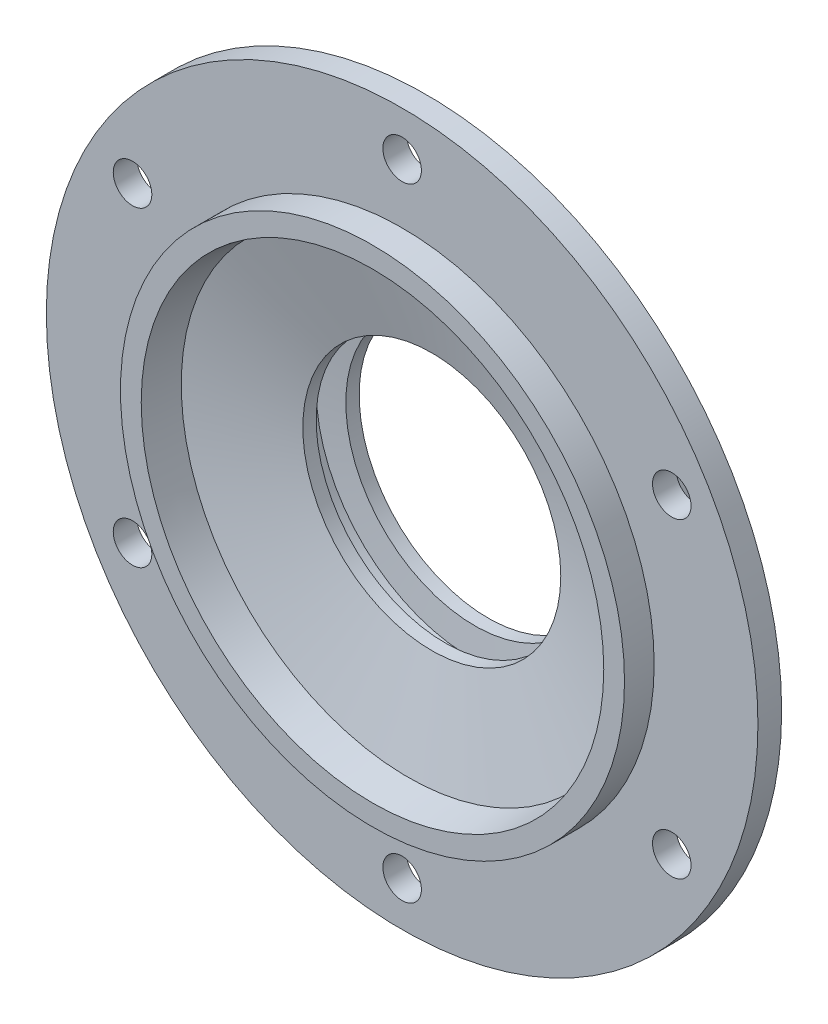
ISO-10303-21;
HEADER;
FILE_DESCRIPTION(('STEP AP214'),'2;1');
FILE_NAME('part.step','',(''),(''),'','','');
FILE_SCHEMA(('AUTOMOTIVE_DESIGN { 1 0 10303 214 1 1 1 1 }'));
ENDSEC;
DATA;
#1=APPLICATION_CONTEXT('core data for automotive mechanical design processes');
#2=APPLICATION_PROTOCOL_DEFINITION('international standard','automotive_design',2000,#1);
#3=PRODUCT_CONTEXT('',#1,'mechanical');
#4=PRODUCT('Part','Part','',(#3));
#5=PRODUCT_RELATED_PRODUCT_CATEGORY('part','',(#4));
#6=PRODUCT_DEFINITION_FORMATION('','',#4);
#7=PRODUCT_DEFINITION_CONTEXT('part definition',#1,'design');
#8=PRODUCT_DEFINITION('design','',#6,#7);
#9=PRODUCT_DEFINITION_SHAPE('','',#8);
#10=(LENGTH_UNIT() NAMED_UNIT(*) SI_UNIT(.MILLI.,.METRE.));
#11=(NAMED_UNIT(*) PLANE_ANGLE_UNIT() SI_UNIT($,.RADIAN.));
#12=(NAMED_UNIT(*) SI_UNIT($,.STERADIAN.) SOLID_ANGLE_UNIT());
#13=UNCERTAINTY_MEASURE_WITH_UNIT(LENGTH_MEASURE(1.E-05),#10,'distance_accuracy_value','');
#14=(GEOMETRIC_REPRESENTATION_CONTEXT(3) GLOBAL_UNCERTAINTY_ASSIGNED_CONTEXT((#13)) GLOBAL_UNIT_ASSIGNED_CONTEXT((#10,
#11,#12)) REPRESENTATION_CONTEXT('',''));
#15=CARTESIAN_POINT('',(0.,0.,0.));
#16=DIRECTION('',(0.,0.,1.));
#17=DIRECTION('',(1.,0.,0.));
#18=AXIS2_PLACEMENT_3D('',#15,#16,#17);
#19=CARTESIAN_POINT('',(0.,0.,17.5000000000001));
#20=DIRECTION('',(0.,0.,1.));
#21=DIRECTION('',(1.,0.,0.));
#22=AXIS2_PLACEMENT_3D('',#19,#20,#21);
#23=CONICAL_SURFACE('',#22,76.5,1.33296039933744);
#24=CARTESIAN_POINT('',(0.,0.,9.49999999999995));
#25=DIRECTION('',(0.,0.,1.));
#26=DIRECTION('',(1.,0.,0.));
#27=AXIS2_PLACEMENT_3D('',#24,#25,#26);
#28=CIRCLE('',#27,43.5);
#29=CARTESIAN_POINT('',(43.5,0.,9.49999999999995));
#30=VERTEX_POINT('',#29);
#31=EDGE_CURVE('E10',#30,#30,#28,.T.);
#32=ORIENTED_EDGE('',*,*,#31,.F.);
#33=EDGE_LOOP('',(#32));
#34=FACE_BOUND('',#33,.T.);
#35=CARTESIAN_POINT('',(0.,0.,17.5000000000001));
#36=DIRECTION('',(0.,0.,1.));
#37=DIRECTION('',(1.,0.,0.));
#38=AXIS2_PLACEMENT_3D('',#35,#36,#37);
#39=CIRCLE('',#38,76.5);
#40=CARTESIAN_POINT('',(76.5,0.,17.5000000000001));
#41=VERTEX_POINT('',#40);
#42=EDGE_CURVE('E51',#41,#41,#39,.T.);
#43=ORIENTED_EDGE('',*,*,#42,.T.);
#44=EDGE_LOOP('',(#43));
#45=FACE_BOUND('',#44,.T.);
#46=ADVANCED_FACE('F32',(#34,#45),#23,.F.);
#47=CARTESIAN_POINT('',(0.,0.,1000.));
#48=DIRECTION('',(0.,0.,1.));
#49=DIRECTION('',(1.,0.,0.));
#50=AXIS2_PLACEMENT_3D('',#47,#48,#49);
#51=CYLINDRICAL_SURFACE('',#50,43.4999999999999);
#52=CARTESIAN_POINT('',(0.,0.,5.));
#53=DIRECTION('',(0.,0.,1.));
#54=DIRECTION('',(1.,0.,0.));
#55=AXIS2_PLACEMENT_3D('',#52,#53,#54);
#56=CIRCLE('',#55,43.4999999999999);
#57=CARTESIAN_POINT('',(43.4999999999999,0.,5.));
#58=VERTEX_POINT('',#57);
#59=EDGE_CURVE('E39',#58,#58,#56,.T.);
#60=ORIENTED_EDGE('',*,*,#59,.F.);
#61=EDGE_LOOP('',(#60));
#62=FACE_BOUND('',#61,.T.);
#63=ORIENTED_EDGE('',*,*,#31,.T.);
#64=EDGE_LOOP('',(#63));
#65=FACE_BOUND('',#64,.T.);
#66=ADVANCED_FACE('F130',(#62,#65),#51,.F.);
#67=CARTESIAN_POINT('',(0.,0.,5.));
#68=DIRECTION('',(0.,0.,-1.));
#69=DIRECTION('',(-1.,0.,0.));
#70=AXIS2_PLACEMENT_3D('',#67,#68,#69);
#71=CONICAL_SURFACE('',#70,43.4999999999999,1.460139105621);
#72=CARTESIAN_POINT('',(0.,0.,4.));
#73=DIRECTION('',(0.,0.,1.));
#74=DIRECTION('',(1.,0.,0.));
#75=AXIS2_PLACEMENT_3D('',#72,#73,#74);
#76=CIRCLE('',#75,52.5);
#77=CARTESIAN_POINT('',(52.5,0.,4.));
#78=VERTEX_POINT('',#77);
#79=EDGE_CURVE('E44',#78,#78,#76,.T.);
#80=ORIENTED_EDGE('',*,*,#79,.F.);
#81=EDGE_LOOP('',(#80));
#82=FACE_BOUND('',#81,.T.);
#83=ORIENTED_EDGE('',*,*,#59,.T.);
#84=EDGE_LOOP('',(#83));
#85=FACE_BOUND('',#84,.T.);
#86=ADVANCED_FACE('F127',(#82,#85),#71,.F.);
#87=CARTESIAN_POINT('',(0.,0.,1000.));
#88=DIRECTION('',(0.,0.,1.));
#89=DIRECTION('',(1.,0.,0.));
#90=AXIS2_PLACEMENT_3D('',#87,#88,#89);
#91=CYLINDRICAL_SURFACE('',#90,52.5);
#92=CARTESIAN_POINT('',(0.,0.,-4.));
#93=DIRECTION('',(0.,0.,1.));
#94=DIRECTION('',(1.,0.,0.));
#95=AXIS2_PLACEMENT_3D('',#92,#93,#94);
#96=CIRCLE('',#95,52.5);
#97=CARTESIAN_POINT('',(52.5,0.,-4.));
#98=VERTEX_POINT('',#97);
#99=EDGE_CURVE('E120',#98,#98,#96,.T.);
#100=ORIENTED_EDGE('',*,*,#99,.F.);
#101=EDGE_LOOP('',(#100));
#102=FACE_BOUND('',#101,.T.);
#103=ORIENTED_EDGE('',*,*,#79,.T.);
#104=EDGE_LOOP('',(#103));
#105=FACE_BOUND('',#104,.T.);
#106=ADVANCED_FACE('F125',(#102,#105),#91,.F.);
#107=CARTESIAN_POINT('',(0.,0.,-4.));
#108=DIRECTION('',(0.,0.,1.));
#109=DIRECTION('',(1.,0.,0.));
#110=AXIS2_PLACEMENT_3D('',#107,#108,#109);
#111=CONICAL_SURFACE('',#110,52.5,1.46013910562101);
#112=CARTESIAN_POINT('',(0.,0.,-4.99999999999989));
#113=DIRECTION('',(0.,0.,1.));
#114=DIRECTION('',(1.,0.,0.));
#115=AXIS2_PLACEMENT_3D('',#112,#113,#114);
#116=CIRCLE('',#115,43.4999999999999);
#117=CARTESIAN_POINT('',(43.4999999999999,0.,-4.99999999999989));
#118=VERTEX_POINT('',#117);
#119=EDGE_CURVE('E117',#118,#118,#116,.T.);
#120=ORIENTED_EDGE('',*,*,#119,.F.);
#121=EDGE_LOOP('',(#120));
#122=FACE_BOUND('',#121,.T.);
#123=ORIENTED_EDGE('',*,*,#99,.T.);
#124=EDGE_LOOP('',(#123));
#125=FACE_BOUND('',#124,.T.);
#126=ADVANCED_FACE('F142',(#122,#125),#111,.F.);
#127=CARTESIAN_POINT('',(0.,0.,1000.));
#128=DIRECTION('',(0.,0.,1.));
#129=DIRECTION('',(1.,0.,0.));
#130=AXIS2_PLACEMENT_3D('',#127,#128,#129);
#131=CYLINDRICAL_SURFACE('',#130,43.4999999999999);
#132=CARTESIAN_POINT('',(0.,0.,-9.50000000000006));
#133=DIRECTION('',(0.,0.,1.));
#134=DIRECTION('',(1.,0.,0.));
#135=AXIS2_PLACEMENT_3D('',#132,#133,#134);
#136=CIRCLE('',#135,43.5);
#137=CARTESIAN_POINT('',(43.5,0.,-9.50000000000006));
#138=VERTEX_POINT('',#137);
#139=EDGE_CURVE('E114',#138,#138,#136,.T.);
#140=ORIENTED_EDGE('',*,*,#139,.F.);
#141=EDGE_LOOP('',(#140));
#142=FACE_BOUND('',#141,.T.);
#143=ORIENTED_EDGE('',*,*,#119,.T.);
#144=EDGE_LOOP('',(#143));
#145=FACE_BOUND('',#144,.T.);
#146=ADVANCED_FACE('F146',(#142,#145),#131,.F.);
#147=CARTESIAN_POINT('',(0.,43.5,-9.50000000000003));
#148=DIRECTION('',(0.,0.,1.));
#149=DIRECTION('',(1.,0.,0.));
#150=AXIS2_PLACEMENT_3D('',#147,#148,#149);
#151=PLANE('',#150);
#152=CARTESIAN_POINT('',(0.,0.,-9.50000000000006));
#153=DIRECTION('',(0.,0.,1.));
#154=DIRECTION('',(1.,0.,0.));
#155=AXIS2_PLACEMENT_3D('',#152,#153,#154);
#156=CIRCLE('',#155,63.);
#157=CARTESIAN_POINT('',(63.,0.,-9.50000000000006));
#158=VERTEX_POINT('',#157);
#159=EDGE_CURVE('E111',#158,#158,#156,.T.);
#160=ORIENTED_EDGE('',*,*,#159,.F.);
#161=EDGE_LOOP('',(#160));
#162=FACE_BOUND('',#161,.T.);
#163=ORIENTED_EDGE('',*,*,#139,.T.);
#164=EDGE_LOOP('',(#163));
#165=FACE_BOUND('',#164,.T.);
#166=ADVANCED_FACE('F150',(#162,#165),#151,.F.);
#167=CARTESIAN_POINT('',(0.,0.,1000.));
#168=DIRECTION('',(0.,0.,1.));
#169=DIRECTION('',(1.,0.,0.));
#170=AXIS2_PLACEMENT_3D('',#167,#168,#169);
#171=CYLINDRICAL_SURFACE('',#170,63.);
#172=CARTESIAN_POINT('',(0.,0.,-2.49999999999995));
#173=DIRECTION('',(0.,0.,1.));
#174=DIRECTION('',(1.,0.,0.));
#175=AXIS2_PLACEMENT_3D('',#172,#173,#174);
#176=CIRCLE('',#175,63.);
#177=CARTESIAN_POINT('',(63.,0.,-2.49999999999995));
#178=VERTEX_POINT('',#177);
#179=EDGE_CURVE('E108',#178,#178,#176,.T.);
#180=ORIENTED_EDGE('',*,*,#179,.F.);
#181=EDGE_LOOP('',(#180));
#182=FACE_BOUND('',#181,.T.);
#183=ORIENTED_EDGE('',*,*,#159,.T.);
#184=EDGE_LOOP('',(#183));
#185=FACE_BOUND('',#184,.T.);
#186=ADVANCED_FACE('F154',(#182,#185),#171,.T.);
#187=CARTESIAN_POINT('',(0.,63.,-2.5));
#188=DIRECTION('',(0.,0.,1.));
#189=DIRECTION('',(1.,0.,0.));
#190=AXIS2_PLACEMENT_3D('',#187,#188,#189);
#191=PLANE('',#190);
#192=CARTESIAN_POINT('',(0.,0.,-2.49999999999995));
#193=DIRECTION('',(0.,0.,1.));
#194=DIRECTION('',(1.,0.,0.));
#195=AXIS2_PLACEMENT_3D('',#192,#193,#194);
#196=CIRCLE('',#195,85.);
#197=CARTESIAN_POINT('',(85.,0.,-2.49999999999995));
#198=VERTEX_POINT('',#197);
#199=EDGE_CURVE('E105',#198,#198,#196,.T.);
#200=ORIENTED_EDGE('',*,*,#199,.F.);
#201=EDGE_LOOP('',(#200));
#202=FACE_BOUND('',#201,.T.);
#203=ORIENTED_EDGE('',*,*,#179,.T.);
#204=EDGE_LOOP('',(#203));
#205=FACE_BOUND('',#204,.T.);
#206=ADVANCED_FACE('F158',(#202,#205),#191,.F.);
#207=CARTESIAN_POINT('',(0.,0.,1000.));
#208=DIRECTION('',(0.,0.,1.));
#209=DIRECTION('',(1.,0.,0.));
#210=AXIS2_PLACEMENT_3D('',#207,#208,#209);
#211=CYLINDRICAL_SURFACE('',#210,85.);
#212=CARTESIAN_POINT('',(0.,0.,11.5));
#213=DIRECTION('',(0.,0.,1.));
#214=DIRECTION('',(1.,0.,0.));
#215=AXIS2_PLACEMENT_3D('',#212,#213,#214);
#216=CIRCLE('',#215,85.);
#217=CARTESIAN_POINT('',(85.,0.,11.5));
#218=VERTEX_POINT('',#217);
#219=EDGE_CURVE('E102',#218,#218,#216,.T.);
#220=ORIENTED_EDGE('',*,*,#219,.F.);
#221=EDGE_LOOP('',(#220));
#222=FACE_BOUND('',#221,.T.);
#223=ORIENTED_EDGE('',*,*,#199,.T.);
#224=EDGE_LOOP('',(#223));
#225=FACE_BOUND('',#224,.T.);
#226=ADVANCED_FACE('F162',(#222,#225),#211,.T.);
#227=CARTESIAN_POINT('',(0.,85.,11.5));
#228=DIRECTION('',(0.,0.,1.));
#229=DIRECTION('',(1.,0.,0.));
#230=AXIS2_PLACEMENT_3D('',#227,#228,#229);
#231=PLANE('',#230);
#232=CARTESIAN_POINT('',(90.9326673973654,52.5000000000011,11.5));
#233=DIRECTION('',(0.,0.,-1.));
#234=DIRECTION('',(-0.50000000000001,0.866025403784433,0.));
#235=AXIS2_PLACEMENT_3D('',#232,#233,#234);
#236=CIRCLE('',#235,6.5);
#237=CARTESIAN_POINT('',(87.6826673973654,58.1291651245999,11.5));
#238=VERTEX_POINT('',#237);
#239=EDGE_CURVE('E76',#238,#238,#236,.T.);
#240=ORIENTED_EDGE('',*,*,#239,.F.);
#241=EDGE_LOOP('',(#240));
#242=FACE_BOUND('',#241,.T.);
#243=CARTESIAN_POINT('',(90.9326673973665,-52.4999999999992,11.5));
#244=DIRECTION('',(0.,0.,-1.));
#245=DIRECTION('',(0.499999999999992,0.866025403784443,0.));
#246=AXIS2_PLACEMENT_3D('',#243,#244,#245);
#247=CIRCLE('',#246,6.5);
#248=CARTESIAN_POINT('',(94.1826673973665,-46.8708348754003,11.5));
#249=VERTEX_POINT('',#248);
#250=EDGE_CURVE('E66',#249,#249,#247,.T.);
#251=ORIENTED_EDGE('',*,*,#250,.F.);
#252=EDGE_LOOP('',(#251));
#253=FACE_BOUND('',#252,.T.);
#254=CARTESIAN_POINT('',(0.,-105.,11.5));
#255=DIRECTION('',(0.,0.,-1.));
#256=DIRECTION('',(1.,0.,0.));
#257=AXIS2_PLACEMENT_3D('',#254,#255,#256);
#258=CIRCLE('',#257,6.5);
#259=CARTESIAN_POINT('',(6.5,-105.,11.5));
#260=VERTEX_POINT('',#259);
#261=EDGE_CURVE('E63',#260,#260,#258,.T.);
#262=ORIENTED_EDGE('',*,*,#261,.F.);
#263=EDGE_LOOP('',(#262));
#264=FACE_BOUND('',#263,.T.);
#265=CARTESIAN_POINT('',(-90.9326673973658,-52.5000000000004,11.5));
#266=DIRECTION('',(0.,0.,-1.));
#267=DIRECTION('',(0.500000000000004,-0.866025403784436,0.));
#268=AXIS2_PLACEMENT_3D('',#265,#266,#267);
#269=CIRCLE('',#268,6.5);
#270=CARTESIAN_POINT('',(-87.6826673973658,-58.1291651245993,11.5));
#271=VERTEX_POINT('',#270);
#272=EDGE_CURVE('E60',#271,#271,#269,.T.);
#273=ORIENTED_EDGE('',*,*,#272,.F.);
#274=EDGE_LOOP('',(#273));
#275=FACE_BOUND('',#274,.T.);
#276=CARTESIAN_POINT('',(-90.9326673973662,52.4999999999998,11.5));
#277=DIRECTION('',(0.,0.,-1.));
#278=DIRECTION('',(-0.499999999999998,-0.86602540378444,0.));
#279=AXIS2_PLACEMENT_3D('',#276,#277,#278);
#280=CIRCLE('',#279,6.5);
#281=CARTESIAN_POINT('',(-94.1826673973662,46.8708348754009,11.5));
#282=VERTEX_POINT('',#281);
#283=EDGE_CURVE('E56',#282,#282,#280,.T.);
#284=ORIENTED_EDGE('',*,*,#283,.F.);
#285=EDGE_LOOP('',(#284));
#286=FACE_BOUND('',#285,.T.);
#287=CARTESIAN_POINT('',(0.,105.,11.5));
#288=DIRECTION('',(0.,0.,-1.));
#289=DIRECTION('',(-1.,0.,0.));
#290=AXIS2_PLACEMENT_3D('',#287,#288,#289);
#291=CIRCLE('',#290,6.5);
#292=CARTESIAN_POINT('',(-6.5,105.,11.5));
#293=VERTEX_POINT('',#292);
#294=EDGE_CURVE('E52',#293,#293,#291,.T.);
#295=ORIENTED_EDGE('',*,*,#294,.F.);
#296=EDGE_LOOP('',(#295));
#297=FACE_BOUND('',#296,.T.);
#298=CARTESIAN_POINT('',(0.,0.,11.5000000000001));
#299=DIRECTION('',(0.,0.,1.));
#300=DIRECTION('',(1.,0.,0.));
#301=AXIS2_PLACEMENT_3D('',#298,#299,#300);
#302=CIRCLE('',#301,120.);
#303=CARTESIAN_POINT('',(120.,0.,11.5000000000001));
#304=VERTEX_POINT('',#303);
#305=EDGE_CURVE('E99',#304,#304,#302,.T.);
#306=ORIENTED_EDGE('',*,*,#305,.F.);
#307=EDGE_LOOP('',(#306));
#308=FACE_BOUND('',#307,.T.);
#309=ORIENTED_EDGE('',*,*,#219,.T.);
#310=EDGE_LOOP('',(#309));
#311=FACE_BOUND('',#310,.T.);
#312=ADVANCED_FACE('F166',(#242,#253,#264,#275,#286,#297,#308,#311),#231,.F.);
#313=CARTESIAN_POINT('',(0.,0.,1000.));
#314=DIRECTION('',(0.,0.,1.));
#315=DIRECTION('',(1.,0.,0.));
#316=AXIS2_PLACEMENT_3D('',#313,#314,#315);
#317=CYLINDRICAL_SURFACE('',#316,120.);
#318=CARTESIAN_POINT('',(0.,0.,19.5000000000001));
#319=DIRECTION('',(0.,0.,1.));
#320=DIRECTION('',(1.,0.,0.));
#321=AXIS2_PLACEMENT_3D('',#318,#319,#320);
#322=CIRCLE('',#321,120.);
#323=CARTESIAN_POINT('',(120.,0.,19.5000000000001));
#324=VERTEX_POINT('',#323);
#325=EDGE_CURVE('E96',#324,#324,#322,.T.);
#326=ORIENTED_EDGE('',*,*,#325,.F.);
#327=EDGE_LOOP('',(#326));
#328=FACE_BOUND('',#327,.T.);
#329=ORIENTED_EDGE('',*,*,#305,.T.);
#330=EDGE_LOOP('',(#329));
#331=FACE_BOUND('',#330,.T.);
#332=ADVANCED_FACE('F170',(#328,#331),#317,.T.);
#333=CARTESIAN_POINT('',(0.,120.,19.5));
#334=DIRECTION('',(0.,0.,-1.));
#335=DIRECTION('',(-1.,0.,0.));
#336=AXIS2_PLACEMENT_3D('',#333,#334,#335);
#337=PLANE('',#336);
#338=CARTESIAN_POINT('',(90.9326673973654,52.5000000000011,19.5));
#339=DIRECTION('',(0.,0.,-1.));
#340=DIRECTION('',(-1.,0.,0.));
#341=AXIS2_PLACEMENT_3D('',#338,#339,#340);
#342=CIRCLE('',#341,6.5);
#343=CARTESIAN_POINT('',(84.4326673973654,52.5000000000011,19.5));
#344=VERTEX_POINT('',#343);
#345=EDGE_CURVE('E35',#344,#344,#342,.T.);
#346=ORIENTED_EDGE('',*,*,#345,.T.);
#347=EDGE_LOOP('',(#346));
#348=FACE_BOUND('',#347,.T.);
#349=CARTESIAN_POINT('',(90.9326673973665,-52.4999999999992,19.5));
#350=DIRECTION('',(0.,0.,-1.));
#351=DIRECTION('',(-1.,0.,0.));
#352=AXIS2_PLACEMENT_3D('',#349,#350,#351);
#353=CIRCLE('',#352,6.5);
#354=CARTESIAN_POINT('',(84.4326673973665,-52.4999999999992,19.5));
#355=VERTEX_POINT('',#354);
#356=EDGE_CURVE('E64',#355,#355,#353,.T.);
#357=ORIENTED_EDGE('',*,*,#356,.T.);
#358=EDGE_LOOP('',(#357));
#359=FACE_BOUND('',#358,.T.);
#360=CARTESIAN_POINT('',(0.,-105.,19.5));
#361=DIRECTION('',(0.,0.,-1.));
#362=DIRECTION('',(-1.,0.,0.));
#363=AXIS2_PLACEMENT_3D('',#360,#361,#362);
#364=CIRCLE('',#363,6.5);
#365=CARTESIAN_POINT('',(-6.5,-105.,19.5));
#366=VERTEX_POINT('',#365);
#367=EDGE_CURVE('E61',#366,#366,#364,.T.);
#368=ORIENTED_EDGE('',*,*,#367,.T.);
#369=EDGE_LOOP('',(#368));
#370=FACE_BOUND('',#369,.T.);
#371=CARTESIAN_POINT('',(-90.9326673973658,-52.5000000000004,19.5));
#372=DIRECTION('',(0.,0.,-1.));
#373=DIRECTION('',(-1.,0.,0.));
#374=AXIS2_PLACEMENT_3D('',#371,#372,#373);
#375=CIRCLE('',#374,6.5);
#376=CARTESIAN_POINT('',(-97.4326673973658,-52.5000000000004,19.5));
#377=VERTEX_POINT('',#376);
#378=EDGE_CURVE('E57',#377,#377,#375,.T.);
#379=ORIENTED_EDGE('',*,*,#378,.T.);
#380=EDGE_LOOP('',(#379));
#381=FACE_BOUND('',#380,.T.);
#382=CARTESIAN_POINT('',(-90.9326673973662,52.4999999999998,19.5));
#383=DIRECTION('',(0.,0.,-1.));
#384=DIRECTION('',(-1.,0.,0.));
#385=AXIS2_PLACEMENT_3D('',#382,#383,#384);
#386=CIRCLE('',#385,6.5);
#387=CARTESIAN_POINT('',(-97.4326673973662,52.4999999999998,19.5));
#388=VERTEX_POINT('',#387);
#389=EDGE_CURVE('E53',#388,#388,#386,.T.);
#390=ORIENTED_EDGE('',*,*,#389,.T.);
#391=EDGE_LOOP('',(#390));
#392=FACE_BOUND('',#391,.T.);
#393=CARTESIAN_POINT('',(0.,105.,19.5));
#394=DIRECTION('',(0.,0.,-1.));
#395=DIRECTION('',(-1.,0.,0.));
#396=AXIS2_PLACEMENT_3D('',#393,#394,#395);
#397=CIRCLE('',#396,6.5);
#398=CARTESIAN_POINT('',(-6.5,105.,19.5));
#399=VERTEX_POINT('',#398);
#400=EDGE_CURVE('E48',#399,#399,#397,.T.);
#401=ORIENTED_EDGE('',*,*,#400,.T.);
#402=EDGE_LOOP('',(#401));
#403=FACE_BOUND('',#402,.T.);
#404=CARTESIAN_POINT('',(0.,0.,19.5000000000001));
#405=DIRECTION('',(0.,0.,1.));
#406=DIRECTION('',(1.,0.,0.));
#407=AXIS2_PLACEMENT_3D('',#404,#405,#406);
#408=CIRCLE('',#407,85.);
#409=CARTESIAN_POINT('',(85.,0.,19.5000000000001));
#410=VERTEX_POINT('',#409);
#411=EDGE_CURVE('E93',#410,#410,#408,.T.);
#412=ORIENTED_EDGE('',*,*,#411,.F.);
#413=EDGE_LOOP('',(#412));
#414=FACE_BOUND('',#413,.T.);
#415=ORIENTED_EDGE('',*,*,#325,.T.);
#416=EDGE_LOOP('',(#415));
#417=FACE_BOUND('',#416,.T.);
#418=ADVANCED_FACE('F174',(#348,#359,#370,#381,#392,#403,#414,#417),#337,.F.);
#419=CARTESIAN_POINT('',(0.,0.,1000.));
#420=DIRECTION('',(0.,0.,1.));
#421=DIRECTION('',(1.,0.,0.));
#422=AXIS2_PLACEMENT_3D('',#419,#420,#421);
#423=CYLINDRICAL_SURFACE('',#422,85.);
#424=CARTESIAN_POINT('',(0.,0.,29.5));
#425=DIRECTION('',(0.,0.,1.));
#426=DIRECTION('',(1.,0.,0.));
#427=AXIS2_PLACEMENT_3D('',#424,#425,#426);
#428=CIRCLE('',#427,85.);
#429=CARTESIAN_POINT('',(85.,0.,29.5));
#430=VERTEX_POINT('',#429);
#431=EDGE_CURVE('E90',#430,#430,#428,.T.);
#432=ORIENTED_EDGE('',*,*,#431,.F.);
#433=EDGE_LOOP('',(#432));
#434=FACE_BOUND('',#433,.T.);
#435=ORIENTED_EDGE('',*,*,#411,.T.);
#436=EDGE_LOOP('',(#435));
#437=FACE_BOUND('',#436,.T.);
#438=ADVANCED_FACE('F178',(#434,#437),#423,.T.);
#439=CARTESIAN_POINT('',(0.,85.,29.5));
#440=DIRECTION('',(0.,0.,-1.));
#441=DIRECTION('',(-1.,0.,0.));
#442=AXIS2_PLACEMENT_3D('',#439,#440,#441);
#443=PLANE('',#442);
#444=CARTESIAN_POINT('',(0.,0.,29.5));
#445=DIRECTION('',(0.,0.,1.));
#446=DIRECTION('',(1.,0.,0.));
#447=AXIS2_PLACEMENT_3D('',#444,#445,#446);
#448=CIRCLE('',#447,78.);
#449=CARTESIAN_POINT('',(78.,0.,29.5));
#450=VERTEX_POINT('',#449);
#451=EDGE_CURVE('E87',#450,#450,#448,.T.);
#452=ORIENTED_EDGE('',*,*,#451,.F.);
#453=EDGE_LOOP('',(#452));
#454=FACE_BOUND('',#453,.T.);
#455=ORIENTED_EDGE('',*,*,#431,.T.);
#456=EDGE_LOOP('',(#455));
#457=FACE_BOUND('',#456,.T.);
#458=ADVANCED_FACE('F182',(#454,#457),#443,.F.);
#459=CARTESIAN_POINT('',(0.,0.,29.5));
#460=DIRECTION('',(0.,0.,1.));
#461=DIRECTION('',(1.,0.,0.));
#462=AXIS2_PLACEMENT_3D('',#459,#460,#461);
#463=CONICAL_SURFACE('',#462,78.,0.124354994546763);
#464=ORIENTED_EDGE('',*,*,#42,.F.);
#465=EDGE_LOOP('',(#464));
#466=FACE_BOUND('',#465,.T.);
#467=ORIENTED_EDGE('',*,*,#451,.T.);
#468=EDGE_LOOP('',(#467));
#469=FACE_BOUND('',#468,.T.);
#470=ADVANCED_FACE('F186',(#466,#469),#463,.F.);
#471=CARTESIAN_POINT('',(0.,105.,29.5));
#472=DIRECTION('',(0.,0.,-1.));
#473=DIRECTION('',(-1.,0.,0.));
#474=AXIS2_PLACEMENT_3D('',#471,#472,#473);
#475=CYLINDRICAL_SURFACE('',#474,6.5);
#476=ORIENTED_EDGE('',*,*,#294,.T.);
#477=EDGE_LOOP('',(#476));
#478=FACE_BOUND('',#477,.T.);
#479=ORIENTED_EDGE('',*,*,#400,.F.);
#480=EDGE_LOOP('',(#479));
#481=FACE_BOUND('',#480,.T.);
#482=ADVANCED_FACE('F190',(#478,#481),#475,.F.);
#483=CARTESIAN_POINT('',(-90.9326673973662,52.4999999999998,29.5));
#484=DIRECTION('',(0.,0.,-1.));
#485=DIRECTION('',(-1.,0.,0.));
#486=AXIS2_PLACEMENT_3D('',#483,#484,#485);
#487=CYLINDRICAL_SURFACE('',#486,6.5);
#488=ORIENTED_EDGE('',*,*,#283,.T.);
#489=EDGE_LOOP('',(#488));
#490=FACE_BOUND('',#489,.T.);
#491=ORIENTED_EDGE('',*,*,#389,.F.);
#492=EDGE_LOOP('',(#491));
#493=FACE_BOUND('',#492,.T.);
#494=ADVANCED_FACE('F194',(#490,#493),#487,.F.);
#495=CARTESIAN_POINT('',(-90.9326673973658,-52.5000000000004,29.5));
#496=DIRECTION('',(0.,0.,-1.));
#497=DIRECTION('',(-1.,0.,0.));
#498=AXIS2_PLACEMENT_3D('',#495,#496,#497);
#499=CYLINDRICAL_SURFACE('',#498,6.5);
#500=ORIENTED_EDGE('',*,*,#272,.T.);
#501=EDGE_LOOP('',(#500));
#502=FACE_BOUND('',#501,.T.);
#503=ORIENTED_EDGE('',*,*,#378,.F.);
#504=EDGE_LOOP('',(#503));
#505=FACE_BOUND('',#504,.T.);
#506=ADVANCED_FACE('F198',(#502,#505),#499,.F.);
#507=CARTESIAN_POINT('',(0.,-105.,29.5));
#508=DIRECTION('',(0.,0.,-1.));
#509=DIRECTION('',(-1.,0.,0.));
#510=AXIS2_PLACEMENT_3D('',#507,#508,#509);
#511=CYLINDRICAL_SURFACE('',#510,6.5);
#512=ORIENTED_EDGE('',*,*,#261,.T.);
#513=EDGE_LOOP('',(#512));
#514=FACE_BOUND('',#513,.T.);
#515=ORIENTED_EDGE('',*,*,#367,.F.);
#516=EDGE_LOOP('',(#515));
#517=FACE_BOUND('',#516,.T.);
#518=ADVANCED_FACE('F202',(#514,#517),#511,.F.);
#519=CARTESIAN_POINT('',(90.9326673973665,-52.4999999999992,29.5));
#520=DIRECTION('',(0.,0.,-1.));
#521=DIRECTION('',(-1.,0.,0.));
#522=AXIS2_PLACEMENT_3D('',#519,#520,#521);
#523=CYLINDRICAL_SURFACE('',#522,6.5);
#524=ORIENTED_EDGE('',*,*,#250,.T.);
#525=EDGE_LOOP('',(#524));
#526=FACE_BOUND('',#525,.T.);
#527=ORIENTED_EDGE('',*,*,#356,.F.);
#528=EDGE_LOOP('',(#527));
#529=FACE_BOUND('',#528,.T.);
#530=ADVANCED_FACE('F206',(#526,#529),#523,.F.);
#531=CARTESIAN_POINT('',(90.9326673973654,52.5000000000011,29.5));
#532=DIRECTION('',(0.,0.,-1.));
#533=DIRECTION('',(-1.,0.,0.));
#534=AXIS2_PLACEMENT_3D('',#531,#532,#533);
#535=CYLINDRICAL_SURFACE('',#534,6.5);
#536=ORIENTED_EDGE('',*,*,#239,.T.);
#537=EDGE_LOOP('',(#536));
#538=FACE_BOUND('',#537,.T.);
#539=ORIENTED_EDGE('',*,*,#345,.F.);
#540=EDGE_LOOP('',(#539));
#541=FACE_BOUND('',#540,.T.);
#542=ADVANCED_FACE('F210',(#538,#541),#535,.F.);
#543=CLOSED_SHELL('',(#46,#66,#86,#106,#126,#146,#166,#186,#206,#226,#312,#332,#418,#438,#458,
#470,#482,#494,#506,#518,#530,#542));
#544=MANIFOLD_SOLID_BREP('B2',#543);
#545=ADVANCED_BREP_SHAPE_REPRESENTATION('',(#18,#544),#14);
#546=SHAPE_DEFINITION_REPRESENTATION(#9,#545);
ENDSEC;
END-ISO-10303-21;
